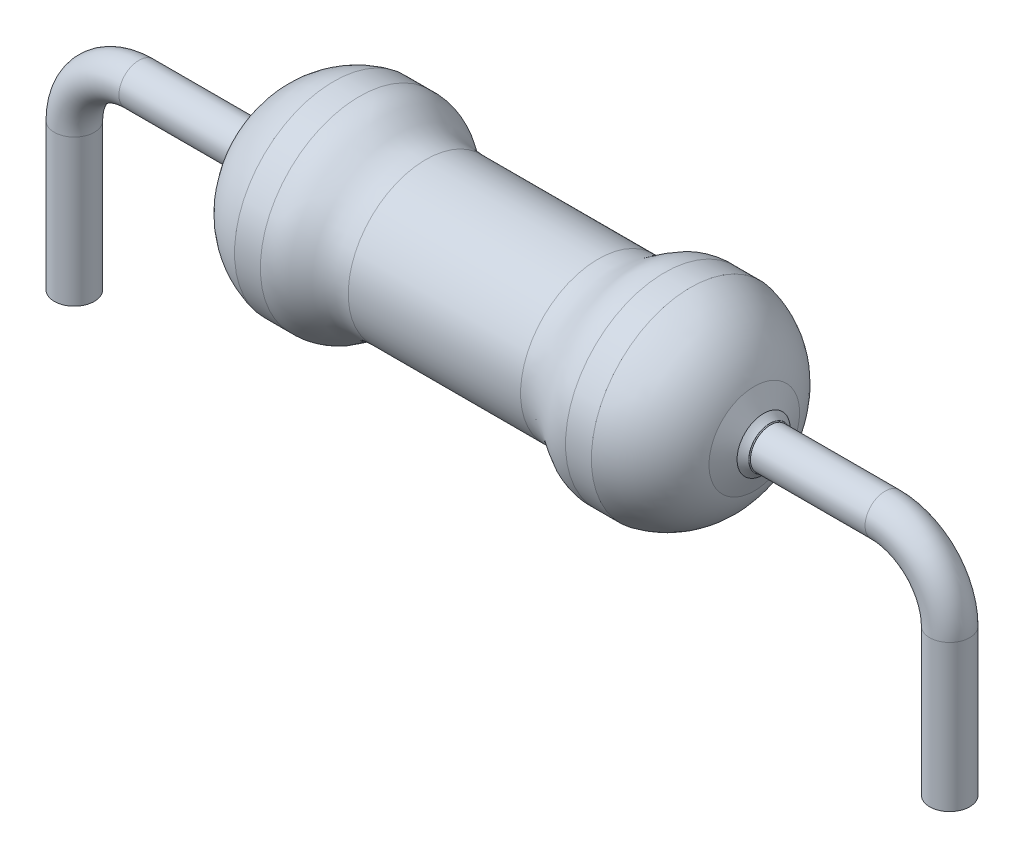
ISO-10303-21;
HEADER;
FILE_DESCRIPTION(('STEP AP214'),'2;1');
FILE_NAME('part.step','',(''),(''),'','','');
FILE_SCHEMA(('AUTOMOTIVE_DESIGN { 1 0 10303 214 1 1 1 1 }'));
ENDSEC;
DATA;
#1=APPLICATION_CONTEXT('core data for automotive mechanical design processes');
#2=APPLICATION_PROTOCOL_DEFINITION('international standard','automotive_design',2000,#1);
#3=PRODUCT_CONTEXT('',#1,'mechanical');
#4=PRODUCT('Part','Part','',(#3));
#5=PRODUCT_RELATED_PRODUCT_CATEGORY('part','',(#4));
#6=PRODUCT_DEFINITION_FORMATION('','',#4);
#7=PRODUCT_DEFINITION_CONTEXT('part definition',#1,'design');
#8=PRODUCT_DEFINITION('design','',#6,#7);
#9=PRODUCT_DEFINITION_SHAPE('','',#8);
#10=(LENGTH_UNIT() NAMED_UNIT(*) SI_UNIT(.MILLI.,.METRE.));
#11=(NAMED_UNIT(*) PLANE_ANGLE_UNIT() SI_UNIT($,.RADIAN.));
#12=(NAMED_UNIT(*) SI_UNIT($,.STERADIAN.) SOLID_ANGLE_UNIT());
#13=UNCERTAINTY_MEASURE_WITH_UNIT(LENGTH_MEASURE(1.E-05),#10,'distance_accuracy_value','');
#14=(GEOMETRIC_REPRESENTATION_CONTEXT(3) GLOBAL_UNCERTAINTY_ASSIGNED_CONTEXT((#13)) GLOBAL_UNIT_ASSIGNED_CONTEXT((#10,
#11,#12)) REPRESENTATION_CONTEXT('',''));
#15=CARTESIAN_POINT('',(0.,0.,0.));
#16=DIRECTION('',(0.,0.,1.));
#17=DIRECTION('',(1.,0.,0.));
#18=AXIS2_PLACEMENT_3D('',#15,#16,#17);
#19=CARTESIAN_POINT('',(-1.,0.900589448181696,0.));
#20=CARTESIAN_POINT('',(-1.37884635761638,0.883227339984709,0.));
#21=CARTESIAN_POINT('',(-1.39186793876412,1.16736210819699,0.));
#22=CARTESIAN_POINT('',(-1.77071429638049,1.15,0.));
#23=B_SPLINE_CURVE_WITH_KNOTS('',3,(#19,#20,#21,#22),.UNSPECIFIED.,.F.,.F.,(4,4),(0.,1.),.UNSPECIFIED.);
#24=CARTESIAN_POINT('',(26.5291584484715,0.,0.));
#25=DIRECTION('',(1.,0.,0.));
#26=AXIS1_PLACEMENT('',#24,#25);
#27=SURFACE_OF_REVOLUTION('',#23,#26);
#28=CARTESIAN_POINT('',(-1.7707142963805,0.,0.));
#29=DIRECTION('',(1.,0.,0.));
#30=DIRECTION('',(0.,0.,-1.));
#31=AXIS2_PLACEMENT_3D('',#28,#29,#30);
#32=CIRCLE('',#31,1.15);
#33=CARTESIAN_POINT('',(-1.7707142963805,0.,-1.15));
#34=VERTEX_POINT('',#33);
#35=EDGE_CURVE('E53',#34,#34,#32,.T.);
#36=ORIENTED_EDGE('',*,*,#35,.T.);
#37=EDGE_LOOP('',(#36));
#38=FACE_BOUND('',#37,.T.);
#39=CARTESIAN_POINT('',(-1.,0.,0.));
#40=DIRECTION('',(1.,0.,0.));
#41=DIRECTION('',(0.,0.,-1.));
#42=AXIS2_PLACEMENT_3D('',#39,#40,#41);
#43=CIRCLE('',#42,0.900589448181695);
#44=CARTESIAN_POINT('',(-1.,0.,-0.900589448181695));
#45=VERTEX_POINT('',#44);
#46=EDGE_CURVE('E86',#45,#45,#43,.T.);
#47=ORIENTED_EDGE('',*,*,#46,.F.);
#48=EDGE_LOOP('',(#47));
#49=FACE_BOUND('',#48,.T.);
#50=ADVANCED_FACE('F33',(#38,#49),#27,.F.);
#51=CARTESIAN_POINT('',(26.5291584484715,0.,0.));
#52=DIRECTION('',(1.,0.,0.));
#53=DIRECTION('',(0.,0.,-1.));
#54=AXIS2_PLACEMENT_3D('',#51,#52,#53);
#55=CYLINDRICAL_SURFACE('',#54,1.15);
#56=CARTESIAN_POINT('',(-2.07071429638049,0.,0.));
#57=DIRECTION('',(1.,0.,0.));
#58=DIRECTION('',(0.,0.,-1.));
#59=AXIS2_PLACEMENT_3D('',#56,#57,#58);
#60=CIRCLE('',#59,1.15);
#61=CARTESIAN_POINT('',(-2.07071429638049,0.,-1.15));
#62=VERTEX_POINT('',#61);
#63=EDGE_CURVE('E56',#62,#62,#60,.T.);
#64=ORIENTED_EDGE('',*,*,#63,.T.);
#65=EDGE_LOOP('',(#64));
#66=FACE_BOUND('',#65,.T.);
#67=ORIENTED_EDGE('',*,*,#35,.F.);
#68=EDGE_LOOP('',(#67));
#69=FACE_BOUND('',#68,.T.);
#70=ADVANCED_FACE('F143',(#66,#69),#55,.T.);
#71=CARTESIAN_POINT('',(-1.875583256954,0.,0.));
#72=DIRECTION('',(1.,0.,0.));
#73=DIRECTION('',(0.,0.,-1.));
#74=AXIS2_PLACEMENT_3D('',#71,#72,#73);
#75=DEGENERATE_TOROIDAL_SURFACE('',#74,0.166348894007553,1.00281883751146,.T.);
#76=CARTESIAN_POINT('',(-2.81187455294116,0.,0.));
#77=DIRECTION('',(1.,0.,0.));
#78=DIRECTION('',(0.,0.,-1.));
#79=AXIS2_PLACEMENT_3D('',#76,#77,#78);
#80=CIRCLE('',#79,0.525520482425257);
#81=CARTESIAN_POINT('',(-2.81187455294116,0.,-0.525520482425257));
#82=VERTEX_POINT('',#81);
#83=EDGE_CURVE('E59',#82,#82,#80,.T.);
#84=ORIENTED_EDGE('',*,*,#83,.T.);
#85=EDGE_LOOP('',(#84));
#86=FACE_BOUND('',#85,.T.);
#87=ORIENTED_EDGE('',*,*,#63,.F.);
#88=EDGE_LOOP('',(#87));
#89=FACE_BOUND('',#88,.T.);
#90=ADVANCED_FACE('F139',(#86,#89),#75,.T.);
#91=CARTESIAN_POINT('',(-2.81187455294116,0.,0.));
#92=DIRECTION('',(1.,0.,0.));
#93=DIRECTION('',(0.,0.,-1.));
#94=AXIS2_PLACEMENT_3D('',#91,#92,#93);
#95=CONICAL_SURFACE('',#94,0.525520482425257,1.10745567920711);
#96=CARTESIAN_POINT('',(-2.92036473758165,0.,0.));
#97=DIRECTION('',(1.,0.,0.));
#98=DIRECTION('',(0.,0.,-1.));
#99=AXIS2_PLACEMENT_3D('',#96,#97,#98);
#100=CIRCLE('',#99,0.30837349934916);
#101=CARTESIAN_POINT('',(-2.92036473758165,0.,-0.30837349934916));
#102=VERTEX_POINT('',#101);
#103=EDGE_CURVE('E62',#102,#102,#100,.T.);
#104=ORIENTED_EDGE('',*,*,#103,.T.);
#105=EDGE_LOOP('',(#104));
#106=FACE_BOUND('',#105,.T.);
#107=ORIENTED_EDGE('',*,*,#83,.F.);
#108=EDGE_LOOP('',(#107));
#109=FACE_BOUND('',#108,.T.);
#110=ADVANCED_FACE('F135',(#106,#109),#95,.T.);
#111=CARTESIAN_POINT('',(-3.28393110155342,0.,0.));
#112=DIRECTION('',(1.,0.,0.));
#113=DIRECTION('',(0.,0.,-1.));
#114=AXIS2_PLACEMENT_3D('',#111,#112,#113);
#115=TOROIDAL_SURFACE('',#114,0.625692428635916,0.482567926716381);
#116=CARTESIAN_POINT('',(-2.99038822692497,0.,0.));
#117=DIRECTION('',(1.,0.,0.));
#118=DIRECTION('',(0.,0.,-1.));
#119=AXIS2_PLACEMENT_3D('',#116,#117,#118);
#120=CIRCLE('',#119,0.242672344762742);
#121=CARTESIAN_POINT('',(-2.99038822692497,0.,-0.242672344762742));
#122=VERTEX_POINT('',#121);
#123=EDGE_CURVE('E65',#122,#122,#120,.T.);
#124=ORIENTED_EDGE('',*,*,#123,.T.);
#125=EDGE_LOOP('',(#124));
#126=FACE_BOUND('',#125,.T.);
#127=ORIENTED_EDGE('',*,*,#103,.F.);
#128=EDGE_LOOP('',(#127));
#129=FACE_BOUND('',#128,.T.);
#130=ADVANCED_FACE('F132',(#126,#129),#115,.F.);
#131=CARTESIAN_POINT('',(-2.99038822692497,0.,0.));
#132=DIRECTION('',(1.,0.,0.));
#133=DIRECTION('',(0.,0.,-1.));
#134=AXIS2_PLACEMENT_3D('',#131,#132,#133);
#135=CONICAL_SURFACE('',#134,0.242672344762742,0.240601685372195);
#136=CARTESIAN_POINT('',(-2.99238287023216,0.,0.));
#137=DIRECTION('',(-1.,0.,0.));
#138=DIRECTION('',(0.,0.,1.));
#139=AXIS2_PLACEMENT_3D('',#136,#137,#138);
#140=CIRCLE('',#139,0.242182950021977);
#141=CARTESIAN_POINT('',(-2.99238287023216,0.,0.242182950021977));
#142=VERTEX_POINT('',#141);
#143=EDGE_CURVE('E40',#142,#142,#140,.F.);
#144=ORIENTED_EDGE('',*,*,#143,.T.);
#145=EDGE_LOOP('',(#144));
#146=FACE_BOUND('',#145,.T.);
#147=ORIENTED_EDGE('',*,*,#123,.F.);
#148=EDGE_LOOP('',(#147));
#149=FACE_BOUND('',#148,.T.);
#150=ADVANCED_FACE('F128',(#146,#149),#135,.T.);
#151=CARTESIAN_POINT('',(3.,0.,0.));
#152=DIRECTION('',(-1.,0.,0.));
#153=DIRECTION('',(0.,0.,1.));
#154=AXIS2_PLACEMENT_3D('',#151,#152,#153);
#155=CONICAL_SURFACE('',#154,0.240314052843878,0.240601685372195);
#156=CARTESIAN_POINT('',(2.99238287023216,0.,0.));
#157=DIRECTION('',(1.,0.,0.));
#158=DIRECTION('',(0.,0.,-1.));
#159=AXIS2_PLACEMENT_3D('',#156,#157,#158);
#160=CIRCLE('',#159,0.242182950021977);
#161=CARTESIAN_POINT('',(2.99238287023216,0.,-0.242182950021977));
#162=VERTEX_POINT('',#161);
#163=EDGE_CURVE('E44',#162,#162,#160,.F.);
#164=ORIENTED_EDGE('',*,*,#163,.T.);
#165=EDGE_LOOP('',(#164));
#166=FACE_BOUND('',#165,.T.);
#167=CARTESIAN_POINT('',(2.99038822692497,0.,0.));
#168=DIRECTION('',(1.,0.,0.));
#169=DIRECTION('',(0.,0.,-1.));
#170=AXIS2_PLACEMENT_3D('',#167,#168,#169);
#171=CIRCLE('',#170,0.242672344762742);
#172=CARTESIAN_POINT('',(2.99038822692497,0.,-0.242672344762742));
#173=VERTEX_POINT('',#172);
#174=EDGE_CURVE('E68',#173,#173,#171,.T.);
#175=ORIENTED_EDGE('',*,*,#174,.T.);
#176=EDGE_LOOP('',(#175));
#177=FACE_BOUND('',#176,.T.);
#178=ADVANCED_FACE('F124',(#166,#177),#155,.T.);
#179=CARTESIAN_POINT('',(3.28393110155342,0.,0.));
#180=DIRECTION('',(1.,0.,0.));
#181=DIRECTION('',(0.,0.,-1.));
#182=AXIS2_PLACEMENT_3D('',#179,#180,#181);
#183=TOROIDAL_SURFACE('',#182,0.625692428635916,0.482567926716381);
#184=CARTESIAN_POINT('',(2.92036473758165,0.,0.));
#185=DIRECTION('',(1.,0.,0.));
#186=DIRECTION('',(0.,0.,-1.));
#187=AXIS2_PLACEMENT_3D('',#184,#185,#186);
#188=CIRCLE('',#187,0.30837349934916);
#189=CARTESIAN_POINT('',(2.92036473758165,0.,-0.30837349934916));
#190=VERTEX_POINT('',#189);
#191=EDGE_CURVE('E71',#190,#190,#188,.T.);
#192=ORIENTED_EDGE('',*,*,#191,.T.);
#193=EDGE_LOOP('',(#192));
#194=FACE_BOUND('',#193,.T.);
#195=ORIENTED_EDGE('',*,*,#174,.F.);
#196=EDGE_LOOP('',(#195));
#197=FACE_BOUND('',#196,.T.);
#198=ADVANCED_FACE('F120',(#194,#197),#183,.F.);
#199=CARTESIAN_POINT('',(2.92036473758165,0.,0.));
#200=DIRECTION('',(-1.,0.,0.));
#201=DIRECTION('',(0.,0.,1.));
#202=AXIS2_PLACEMENT_3D('',#199,#200,#201);
#203=CONICAL_SURFACE('',#202,0.30837349934916,1.10745567920711);
#204=CARTESIAN_POINT('',(2.81187455294116,0.,0.));
#205=DIRECTION('',(1.,0.,0.));
#206=DIRECTION('',(0.,0.,-1.));
#207=AXIS2_PLACEMENT_3D('',#204,#205,#206);
#208=CIRCLE('',#207,0.525520482425257);
#209=CARTESIAN_POINT('',(2.81187455294116,0.,-0.525520482425257));
#210=VERTEX_POINT('',#209);
#211=EDGE_CURVE('E74',#210,#210,#208,.T.);
#212=ORIENTED_EDGE('',*,*,#211,.T.);
#213=EDGE_LOOP('',(#212));
#214=FACE_BOUND('',#213,.T.);
#215=ORIENTED_EDGE('',*,*,#191,.F.);
#216=EDGE_LOOP('',(#215));
#217=FACE_BOUND('',#216,.T.);
#218=ADVANCED_FACE('F116',(#214,#217),#203,.T.);
#219=CARTESIAN_POINT('',(1.875583256954,0.,0.));
#220=DIRECTION('',(1.,0.,0.));
#221=DIRECTION('',(0.,0.,-1.));
#222=AXIS2_PLACEMENT_3D('',#219,#220,#221);
#223=DEGENERATE_TOROIDAL_SURFACE('',#222,0.166348894007553,1.00281883751146,.T.);
#224=CARTESIAN_POINT('',(2.07071429638049,0.,0.));
#225=DIRECTION('',(1.,0.,0.));
#226=DIRECTION('',(0.,0.,-1.));
#227=AXIS2_PLACEMENT_3D('',#224,#225,#226);
#228=CIRCLE('',#227,1.15);
#229=CARTESIAN_POINT('',(2.07071429638049,0.,-1.15));
#230=VERTEX_POINT('',#229);
#231=EDGE_CURVE('E77',#230,#230,#228,.T.);
#232=ORIENTED_EDGE('',*,*,#231,.T.);
#233=EDGE_LOOP('',(#232));
#234=FACE_BOUND('',#233,.T.);
#235=ORIENTED_EDGE('',*,*,#211,.F.);
#236=EDGE_LOOP('',(#235));
#237=FACE_BOUND('',#236,.T.);
#238=ADVANCED_FACE('F112',(#234,#237),#223,.T.);
#239=CARTESIAN_POINT('',(26.5291584484715,0.,0.));
#240=DIRECTION('',(1.,0.,0.));
#241=DIRECTION('',(0.,0.,-1.));
#242=AXIS2_PLACEMENT_3D('',#239,#240,#241);
#243=CYLINDRICAL_SURFACE('',#242,1.15);
#244=CARTESIAN_POINT('',(1.7707142963805,0.,0.));
#245=DIRECTION('',(1.,0.,0.));
#246=DIRECTION('',(0.,0.,-1.));
#247=AXIS2_PLACEMENT_3D('',#244,#245,#246);
#248=CIRCLE('',#247,1.15);
#249=CARTESIAN_POINT('',(1.7707142963805,0.,-1.15));
#250=VERTEX_POINT('',#249);
#251=EDGE_CURVE('E80',#250,#250,#248,.T.);
#252=ORIENTED_EDGE('',*,*,#251,.T.);
#253=EDGE_LOOP('',(#252));
#254=FACE_BOUND('',#253,.T.);
#255=ORIENTED_EDGE('',*,*,#231,.F.);
#256=EDGE_LOOP('',(#255));
#257=FACE_BOUND('',#256,.T.);
#258=ADVANCED_FACE('F107',(#254,#257),#243,.T.);
#259=CARTESIAN_POINT('',(1.77071429638049,1.15,0.));
#260=CARTESIAN_POINT('',(1.39186793876412,1.167362108197,0.));
#261=CARTESIAN_POINT('',(1.37884635761638,0.883227339984716,0.));
#262=CARTESIAN_POINT('',(1.,0.900589448181696,0.));
#263=B_SPLINE_CURVE_WITH_KNOTS('',3,(#259,#260,#261,#262),.UNSPECIFIED.,.F.,.F.,(4,4),(0.,1.),.UNSPECIFIED.);
#264=CARTESIAN_POINT('',(26.5291584484715,0.,0.));
#265=DIRECTION('',(1.,0.,0.));
#266=AXIS1_PLACEMENT('',#264,#265);
#267=SURFACE_OF_REVOLUTION('',#263,#266);
#268=CARTESIAN_POINT('',(1.,0.,0.));
#269=DIRECTION('',(1.,0.,0.));
#270=DIRECTION('',(0.,0.,-1.));
#271=AXIS2_PLACEMENT_3D('',#268,#269,#270);
#272=CIRCLE('',#271,0.900589448181695);
#273=CARTESIAN_POINT('',(1.,0.,-0.900589448181695));
#274=VERTEX_POINT('',#273);
#275=EDGE_CURVE('E83',#274,#274,#272,.T.);
#276=ORIENTED_EDGE('',*,*,#275,.T.);
#277=EDGE_LOOP('',(#276));
#278=FACE_BOUND('',#277,.T.);
#279=ORIENTED_EDGE('',*,*,#251,.F.);
#280=EDGE_LOOP('',(#279));
#281=FACE_BOUND('',#280,.T.);
#282=ADVANCED_FACE('F102',(#278,#281),#267,.F.);
#283=CARTESIAN_POINT('',(26.5291584484715,0.,0.));
#284=DIRECTION('',(1.,0.,0.));
#285=DIRECTION('',(0.,0.,-1.));
#286=AXIS2_PLACEMENT_3D('',#283,#284,#285);
#287=CYLINDRICAL_SURFACE('',#286,0.900589448181695);
#288=ORIENTED_EDGE('',*,*,#46,.T.);
#289=EDGE_LOOP('',(#288));
#290=FACE_BOUND('',#289,.T.);
#291=ORIENTED_EDGE('',*,*,#275,.F.);
#292=EDGE_LOOP('',(#291));
#293=FACE_BOUND('',#292,.T.);
#294=ADVANCED_FACE('F106',(#290,#293),#287,.T.);
#295=CARTESIAN_POINT('',(2.99,0.,0.));
#296=DIRECTION('',(1.,0.,0.));
#297=DIRECTION('',(0.,0.,-1.));
#298=AXIS2_PLACEMENT_3D('',#295,#296,#297);
#299=TOROIDAL_SURFACE('',#298,0.232471002253547,0.01);
#300=ORIENTED_EDGE('',*,*,#163,.F.);
#301=EDGE_LOOP('',(#300));
#302=FACE_BOUND('',#301,.T.);
#303=CARTESIAN_POINT('',(3.,0.,0.));
#304=DIRECTION('',(1.,0.,0.));
#305=DIRECTION('',(0.,0.,-1.));
#306=AXIS2_PLACEMENT_3D('',#303,#304,#305);
#307=CIRCLE('',#306,0.232471002253547);
#308=CARTESIAN_POINT('',(3.,0.,-0.232471002253547));
#309=VERTEX_POINT('',#308);
#310=EDGE_CURVE('E48',#309,#309,#307,.T.);
#311=ORIENTED_EDGE('',*,*,#310,.F.);
#312=EDGE_LOOP('',(#311));
#313=FACE_BOUND('',#312,.T.);
#314=ADVANCED_FACE('F150',(#302,#313),#299,.T.);
#315=CARTESIAN_POINT('',(-2.99,0.,0.));
#316=DIRECTION('',(-1.,0.,0.));
#317=DIRECTION('',(0.,0.,1.));
#318=AXIS2_PLACEMENT_3D('',#315,#316,#317);
#319=TOROIDAL_SURFACE('',#318,0.232471002253547,0.01);
#320=CARTESIAN_POINT('',(-3.,0.,0.));
#321=DIRECTION('',(-1.,0.,0.));
#322=DIRECTION('',(0.,0.,1.));
#323=AXIS2_PLACEMENT_3D('',#320,#321,#322);
#324=CIRCLE('',#323,0.232471002253547);
#325=CARTESIAN_POINT('',(-3.,0.,0.232471002253547));
#326=VERTEX_POINT('',#325);
#327=EDGE_CURVE('E10',#326,#326,#324,.T.);
#328=ORIENTED_EDGE('',*,*,#327,.F.);
#329=EDGE_LOOP('',(#328));
#330=FACE_BOUND('',#329,.T.);
#331=ORIENTED_EDGE('',*,*,#143,.F.);
#332=EDGE_LOOP('',(#331));
#333=FACE_BOUND('',#332,.T.);
#334=ADVANCED_FACE('F35',(#330,#333),#319,.T.);
#335=CARTESIAN_POINT('',(5.08,-2.45,0.));
#336=DIRECTION('',(0.,-1.,0.));
#337=DIRECTION('',(0.,0.,-1.));
#338=AXIS2_PLACEMENT_3D('',#335,#336,#337);
#339=PLANE('',#338);
#340=CARTESIAN_POINT('',(5.08,-2.45,0.));
#341=DIRECTION('',(0.,-1.,0.));
#342=DIRECTION('',(0.,0.,-1.));
#343=AXIS2_PLACEMENT_3D('',#340,#341,#342);
#344=CIRCLE('',#343,0.232471002253547);
#345=CARTESIAN_POINT('',(5.08,-2.45,-0.232471002253547));
#346=VERTEX_POINT('',#345);
#347=EDGE_CURVE('E89',#346,#346,#344,.T.);
#348=ORIENTED_EDGE('',*,*,#347,.T.);
#349=EDGE_LOOP('',(#348));
#350=FACE_BOUND('',#349,.T.);
#351=ADVANCED_FACE('F157',(#350),#339,.T.);
#352=CARTESIAN_POINT('',(3.,0.,0.));
#353=DIRECTION('',(1.,0.,0.));
#354=DIRECTION('',(0.,1.,0.));
#355=AXIS2_PLACEMENT_3D('',#352,#353,#354);
#356=CYLINDRICAL_SURFACE('',#355,0.232471002253547);
#357=CARTESIAN_POINT('',(4.33,0.,0.));
#358=DIRECTION('',(1.,0.,0.));
#359=DIRECTION('',(0.,0.,-1.));
#360=AXIS2_PLACEMENT_3D('',#357,#358,#359);
#361=CIRCLE('',#360,0.232471002253547);
#362=CARTESIAN_POINT('',(4.33,0.232471002253547,0.));
#363=VERTEX_POINT('',#362);
#364=EDGE_CURVE('E196',#363,#363,#361,.T.);
#365=ORIENTED_EDGE('',*,*,#364,.F.);
#366=EDGE_LOOP('',(#365));
#367=FACE_BOUND('',#366,.T.);
#368=ORIENTED_EDGE('',*,*,#310,.T.);
#369=EDGE_LOOP('',(#368));
#370=FACE_BOUND('',#369,.T.);
#371=ADVANCED_FACE('F165',(#367,#370),#356,.T.);
#372=CARTESIAN_POINT('',(4.33,-0.75,0.));
#373=DIRECTION('',(0.,0.,-1.));
#374=DIRECTION('',(-1.,0.,0.));
#375=AXIS2_PLACEMENT_3D('',#372,#373,#374);
#376=TOROIDAL_SURFACE('',#375,0.75,0.232471002253547);
#377=CARTESIAN_POINT('',(5.08,-0.75,0.));
#378=DIRECTION('',(0.,-1.,0.));
#379=DIRECTION('',(0.,0.,-1.));
#380=AXIS2_PLACEMENT_3D('',#377,#378,#379);
#381=CIRCLE('',#380,0.232471002253547);
#382=CARTESIAN_POINT('',(5.31247100225355,-0.75,0.));
#383=VERTEX_POINT('',#382);
#384=EDGE_CURVE('E195',#383,#383,#381,.T.);
#385=CARTESIAN_POINT('',(4.33,-0.75,0.));
#386=DIRECTION('',(0.,0.,-1.));
#387=DIRECTION('',(-1.,0.,0.));
#388=AXIS2_PLACEMENT_3D('',#385,#386,#387);
#389=CIRCLE('',#388,0.982471002253547);
#390=EDGE_CURVE('',#363,#383,#389,.T.);
#391=ORIENTED_EDGE('',*,*,#364,.T.);
#392=ORIENTED_EDGE('',*,*,#384,.F.);
#393=ORIENTED_EDGE('',*,*,#390,.T.);
#394=ORIENTED_EDGE('',*,*,#390,.F.);
#395=EDGE_LOOP('',(#391,#393,#392,#394));
#396=FACE_BOUND('',#395,.T.);
#397=ADVANCED_FACE('F167',(#396),#376,.T.);
#398=CARTESIAN_POINT('',(5.08,-0.75,0.));
#399=DIRECTION('',(0.,-1.,0.));
#400=DIRECTION('',(0.,0.,-1.));
#401=AXIS2_PLACEMENT_3D('',#398,#399,#400);
#402=CYLINDRICAL_SURFACE('',#401,0.232471002253547);
#403=ORIENTED_EDGE('',*,*,#347,.F.);
#404=EDGE_LOOP('',(#403));
#405=FACE_BOUND('',#404,.T.);
#406=ORIENTED_EDGE('',*,*,#384,.T.);
#407=EDGE_LOOP('',(#406));
#408=FACE_BOUND('',#407,.T.);
#409=ADVANCED_FACE('F159',(#405,#408),#402,.T.);
#410=CARTESIAN_POINT('',(-5.08,-2.45,0.));
#411=DIRECTION('',(0.,-1.,0.));
#412=DIRECTION('',(0.,0.,-1.));
#413=AXIS2_PLACEMENT_3D('',#410,#411,#412);
#414=PLANE('',#413);
#415=CARTESIAN_POINT('',(-5.08,-2.45,0.));
#416=DIRECTION('',(0.,1.,0.));
#417=DIRECTION('',(0.,0.,-1.));
#418=AXIS2_PLACEMENT_3D('',#415,#416,#417);
#419=CIRCLE('',#418,0.232471002253547);
#420=CARTESIAN_POINT('',(-5.08,-2.45,-0.232471002253547));
#421=VERTEX_POINT('',#420);
#422=EDGE_CURVE('E199',#421,#421,#419,.F.);
#423=ORIENTED_EDGE('',*,*,#422,.T.);
#424=EDGE_LOOP('',(#423));
#425=FACE_BOUND('',#424,.T.);
#426=ADVANCED_FACE('F180',(#425),#414,.T.);
#427=CARTESIAN_POINT('',(-3.,0.,0.));
#428=DIRECTION('',(-1.,0.,0.));
#429=DIRECTION('',(0.,-1.,0.));
#430=AXIS2_PLACEMENT_3D('',#427,#428,#429);
#431=CYLINDRICAL_SURFACE('',#430,0.232471002253547);
#432=CARTESIAN_POINT('',(-4.33,0.,0.));
#433=DIRECTION('',(1.,0.,0.));
#434=DIRECTION('',(0.,0.,-1.));
#435=AXIS2_PLACEMENT_3D('',#432,#433,#434);
#436=CIRCLE('',#435,0.232471002253547);
#437=CARTESIAN_POINT('',(-4.33,0.232471002253547,0.));
#438=VERTEX_POINT('',#437);
#439=EDGE_CURVE('E207',#438,#438,#436,.F.);
#440=ORIENTED_EDGE('',*,*,#439,.F.);
#441=EDGE_LOOP('',(#440));
#442=FACE_BOUND('',#441,.T.);
#443=ORIENTED_EDGE('',*,*,#327,.T.);
#444=EDGE_LOOP('',(#443));
#445=FACE_BOUND('',#444,.T.);
#446=ADVANCED_FACE('F188',(#442,#445),#431,.T.);
#447=CARTESIAN_POINT('',(-4.33,-0.75,0.));
#448=DIRECTION('',(0.,0.,1.));
#449=DIRECTION('',(1.,0.,0.));
#450=AXIS2_PLACEMENT_3D('',#447,#448,#449);
#451=TOROIDAL_SURFACE('',#450,0.75,0.232471002253547);
#452=CARTESIAN_POINT('',(-5.08,-0.75,0.));
#453=DIRECTION('',(0.,1.,0.));
#454=DIRECTION('',(0.,0.,-1.));
#455=AXIS2_PLACEMENT_3D('',#452,#453,#454);
#456=CIRCLE('',#455,0.232471002253547);
#457=CARTESIAN_POINT('',(-5.31247100225355,-0.75,0.));
#458=VERTEX_POINT('',#457);
#459=EDGE_CURVE('E204',#458,#458,#456,.F.);
#460=CARTESIAN_POINT('',(-4.33,-0.75,0.));
#461=DIRECTION('',(0.,0.,1.));
#462=DIRECTION('',(1.,0.,0.));
#463=AXIS2_PLACEMENT_3D('',#460,#461,#462);
#464=CIRCLE('',#463,0.982471002253547);
#465=EDGE_CURVE('',#438,#458,#464,.T.);
#466=ORIENTED_EDGE('',*,*,#439,.T.);
#467=ORIENTED_EDGE('',*,*,#459,.F.);
#468=ORIENTED_EDGE('',*,*,#465,.T.);
#469=ORIENTED_EDGE('',*,*,#465,.F.);
#470=EDGE_LOOP('',(#466,#468,#467,#469));
#471=FACE_BOUND('',#470,.T.);
#472=ADVANCED_FACE('F211',(#471),#451,.T.);
#473=CARTESIAN_POINT('',(-5.08,-0.75,0.));
#474=DIRECTION('',(0.,-1.,0.));
#475=DIRECTION('',(0.,0.,-1.));
#476=AXIS2_PLACEMENT_3D('',#473,#474,#475);
#477=CYLINDRICAL_SURFACE('',#476,0.232471002253547);
#478=ORIENTED_EDGE('',*,*,#422,.F.);
#479=EDGE_LOOP('',(#478));
#480=FACE_BOUND('',#479,.T.);
#481=ORIENTED_EDGE('',*,*,#459,.T.);
#482=EDGE_LOOP('',(#481));
#483=FACE_BOUND('',#482,.T.);
#484=ADVANCED_FACE('F177',(#480,#483),#477,.T.);
#485=CLOSED_SHELL('',(#50,#70,#90,#110,#130,#150,#178,#198,#218,#238,#258,#282,#294,#314,#334,
#351,#371,#397,#409,#426,#446,#472,#484));
#486=MANIFOLD_SOLID_BREP('B2',#485);
#487=ADVANCED_BREP_SHAPE_REPRESENTATION('',(#18,#486),#14);
#488=SHAPE_DEFINITION_REPRESENTATION(#9,#487);
ENDSEC;
END-ISO-10303-21;
